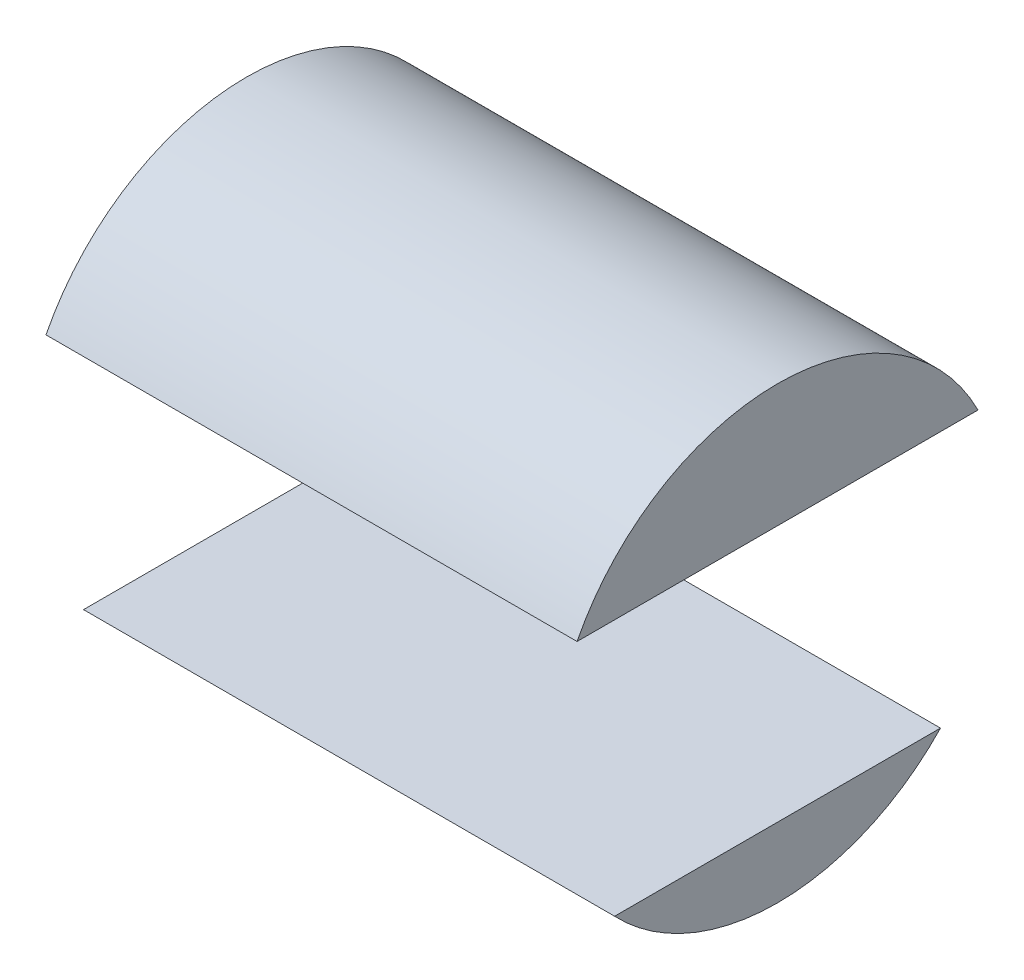
ISO-10303-21;
HEADER;
FILE_DESCRIPTION(('STEP AP214'),'2;1');
FILE_NAME('part.step','',(''),(''),'','','');
FILE_SCHEMA(('AUTOMOTIVE_DESIGN { 1 0 10303 214 1 1 1 1 }'));
ENDSEC;
DATA;
#1=APPLICATION_CONTEXT('core data for automotive mechanical design processes');
#2=APPLICATION_PROTOCOL_DEFINITION('international standard','automotive_design',2000,#1);
#3=PRODUCT_CONTEXT('',#1,'mechanical');
#4=PRODUCT('Part','Part','',(#3));
#5=PRODUCT_RELATED_PRODUCT_CATEGORY('part','',(#4));
#6=PRODUCT_DEFINITION_FORMATION('','',#4);
#7=PRODUCT_DEFINITION_CONTEXT('part definition',#1,'design');
#8=PRODUCT_DEFINITION('design','',#6,#7);
#9=PRODUCT_DEFINITION_SHAPE('','',#8);
#10=(LENGTH_UNIT() NAMED_UNIT(*) SI_UNIT(.MILLI.,.METRE.));
#11=(NAMED_UNIT(*) PLANE_ANGLE_UNIT() SI_UNIT($,.RADIAN.));
#12=(NAMED_UNIT(*) SI_UNIT($,.STERADIAN.) SOLID_ANGLE_UNIT());
#13=UNCERTAINTY_MEASURE_WITH_UNIT(LENGTH_MEASURE(1.E-05),#10,'distance_accuracy_value','');
#14=(GEOMETRIC_REPRESENTATION_CONTEXT(3) GLOBAL_UNCERTAINTY_ASSIGNED_CONTEXT((#13)) GLOBAL_UNIT_ASSIGNED_CONTEXT((#10,
#11,#12)) REPRESENTATION_CONTEXT('',''));
#15=CARTESIAN_POINT('',(0.,0.,0.));
#16=DIRECTION('',(0.,0.,1.));
#17=DIRECTION('',(1.,0.,0.));
#18=AXIS2_PLACEMENT_3D('',#15,#16,#17);
#19=CARTESIAN_POINT('',(120.,0.,0.));
#20=DIRECTION('',(1.,0.,0.));
#21=DIRECTION('',(0.,0.,-1.));
#22=AXIS2_PLACEMENT_3D('',#19,#20,#21);
#23=PLANE('',#22);
#24=DIRECTION('',(0.,0.,1.));
#25=VECTOR('',#24,1.);
#26=CARTESIAN_POINT('',(120.,23.,-30.));
#27=LINE('',#26,#25);
#28=CARTESIAN_POINT('',(120.,23.,-45.2950328402574));
#29=VERTEX_POINT('',#28);
#30=CARTESIAN_POINT('',(120.,23.,45.2950328402574));
#31=VERTEX_POINT('',#30);
#32=EDGE_CURVE('E52',#29,#31,#27,.T.);
#33=ORIENTED_EDGE('',*,*,#32,.F.);
#34=CARTESIAN_POINT('',(120.,0.,0.));
#35=DIRECTION('',(1.,0.,0.));
#36=DIRECTION('',(0.,0.,-1.));
#37=AXIS2_PLACEMENT_3D('',#34,#35,#36);
#38=CIRCLE('',#37,50.8);
#39=EDGE_CURVE('E78',#29,#31,#38,.T.);
#40=ORIENTED_EDGE('',*,*,#39,.T.);
#41=EDGE_LOOP('',(#33,#40));
#42=FACE_BOUND('',#41,.T.);
#43=ADVANCED_FACE('F43',(#42),#23,.T.);
#44=CARTESIAN_POINT('',(0.,0.,0.));
#45=DIRECTION('',(1.,0.,0.));
#46=DIRECTION('',(0.,0.,-1.));
#47=AXIS2_PLACEMENT_3D('',#44,#45,#46);
#48=PLANE('',#47);
#49=CARTESIAN_POINT('',(0.,0.,0.));
#50=DIRECTION('',(1.,0.,0.));
#51=DIRECTION('',(0.,0.,-1.));
#52=AXIS2_PLACEMENT_3D('',#49,#50,#51);
#53=CIRCLE('',#52,50.8);
#54=CARTESIAN_POINT('',(0.,23.,-45.2950328402574));
#55=VERTEX_POINT('',#54);
#56=CARTESIAN_POINT('',(0.,23.,45.2950328402574));
#57=VERTEX_POINT('',#56);
#58=EDGE_CURVE('E46',#55,#57,#53,.T.);
#59=ORIENTED_EDGE('',*,*,#58,.F.);
#60=DIRECTION('',(0.,0.,1.));
#61=VECTOR('',#60,1.);
#62=CARTESIAN_POINT('',(0.,23.,-45.2950328402574));
#63=LINE('',#62,#61);
#64=EDGE_CURVE('E66',#55,#57,#63,.T.);
#65=ORIENTED_EDGE('',*,*,#64,.T.);
#66=EDGE_LOOP('',(#59,#65));
#67=FACE_BOUND('',#66,.T.);
#68=ADVANCED_FACE('F82',(#67),#48,.F.);
#69=CARTESIAN_POINT('',(120.,0.,0.));
#70=DIRECTION('',(-1.,0.,0.));
#71=DIRECTION('',(0.,0.,1.));
#72=AXIS2_PLACEMENT_3D('',#69,#70,#71);
#73=CYLINDRICAL_SURFACE('',#72,50.8);
#74=ORIENTED_EDGE('',*,*,#39,.F.);
#75=DIRECTION('',(1.,0.,0.));
#76=VECTOR('',#75,1.);
#77=CARTESIAN_POINT('',(0.,23.,-45.2950328402574));
#78=LINE('',#77,#76);
#79=EDGE_CURVE('E12',#55,#29,#78,.T.);
#80=ORIENTED_EDGE('',*,*,#79,.F.);
#81=ORIENTED_EDGE('',*,*,#58,.T.);
#82=DIRECTION('',(1.,0.,0.));
#83=VECTOR('',#82,1.);
#84=CARTESIAN_POINT('',(0.,23.,45.2950328402574));
#85=LINE('',#84,#83);
#86=EDGE_CURVE('E71',#57,#31,#85,.T.);
#87=ORIENTED_EDGE('',*,*,#86,.T.);
#88=EDGE_LOOP('',(#74,#80,#81,#87));
#89=FACE_BOUND('',#88,.T.);
#90=ADVANCED_FACE('F77',(#89),#73,.T.);
#91=CARTESIAN_POINT('',(120.,23.,-30.));
#92=DIRECTION('',(0.,-1.,0.));
#93=DIRECTION('',(0.,0.,-1.));
#94=AXIS2_PLACEMENT_3D('',#91,#92,#93);
#95=PLANE('',#94);
#96=ORIENTED_EDGE('',*,*,#86,.F.);
#97=ORIENTED_EDGE('',*,*,#64,.F.);
#98=ORIENTED_EDGE('',*,*,#79,.T.);
#99=ORIENTED_EDGE('',*,*,#32,.T.);
#100=EDGE_LOOP('',(#96,#97,#98,#99));
#101=FACE_BOUND('',#100,.T.);
#102=ADVANCED_FACE('F70',(#101),#95,.T.);
#103=CLOSED_SHELL('',(#43,#68,#90,#102));
#104=MANIFOLD_SOLID_BREP('B2',#103);
#105=CARTESIAN_POINT('',(120.,-35.,30.));
#106=DIRECTION('',(0.,1.,0.));
#107=DIRECTION('',(0.,0.,1.));
#108=AXIS2_PLACEMENT_3D('',#105,#106,#107);
#109=PLANE('',#108);
#110=DIRECTION('',(0.,0.,-1.));
#111=VECTOR('',#110,1.);
#112=CARTESIAN_POINT('',(0.,-35.,30.));
#113=LINE('',#112,#111);
#114=CARTESIAN_POINT('',(0.,-35.,36.8190168255482));
#115=VERTEX_POINT('',#114);
#116=CARTESIAN_POINT('',(0.,-35.,-36.8190168255482));
#117=VERTEX_POINT('',#116);
#118=EDGE_CURVE('E134',#115,#117,#113,.T.);
#119=ORIENTED_EDGE('',*,*,#118,.F.);
#120=DIRECTION('',(1.,0.,0.));
#121=VECTOR('',#120,1.);
#122=CARTESIAN_POINT('',(0.,-35.,36.8190168255482));
#123=LINE('',#122,#121);
#124=CARTESIAN_POINT('',(120.,-35.,36.8190168255482));
#125=VERTEX_POINT('',#124);
#126=EDGE_CURVE('E148',#115,#125,#123,.T.);
#127=ORIENTED_EDGE('',*,*,#126,.T.);
#128=DIRECTION('',(0.,0.,-1.));
#129=VECTOR('',#128,1.);
#130=CARTESIAN_POINT('',(120.,-35.,30.));
#131=LINE('',#130,#129);
#132=CARTESIAN_POINT('',(120.,-35.,-36.8190168255482));
#133=VERTEX_POINT('',#132);
#134=EDGE_CURVE('E141',#125,#133,#131,.T.);
#135=ORIENTED_EDGE('',*,*,#134,.T.);
#136=DIRECTION('',(1.,0.,0.));
#137=VECTOR('',#136,1.);
#138=CARTESIAN_POINT('',(0.,-35.,-36.8190168255482));
#139=LINE('',#138,#137);
#140=EDGE_CURVE('E145',#117,#133,#139,.T.);
#141=ORIENTED_EDGE('',*,*,#140,.F.);
#142=EDGE_LOOP('',(#119,#127,#135,#141));
#143=FACE_BOUND('',#142,.T.);
#144=ADVANCED_FACE('F118',(#143),#109,.T.);
#145=CARTESIAN_POINT('',(120.,0.,0.));
#146=DIRECTION('',(-1.,0.,0.));
#147=DIRECTION('',(0.,0.,1.));
#148=AXIS2_PLACEMENT_3D('',#145,#146,#147);
#149=CYLINDRICAL_SURFACE('',#148,50.8);
#150=CARTESIAN_POINT('',(120.,0.,0.));
#151=DIRECTION('',(1.,0.,0.));
#152=DIRECTION('',(0.,0.,-1.));
#153=AXIS2_PLACEMENT_3D('',#150,#151,#152);
#154=CIRCLE('',#153,50.8);
#155=EDGE_CURVE('E41',#125,#133,#154,.T.);
#156=ORIENTED_EDGE('',*,*,#155,.F.);
#157=ORIENTED_EDGE('',*,*,#126,.F.);
#158=CARTESIAN_POINT('',(0.,0.,0.));
#159=DIRECTION('',(1.,0.,0.));
#160=DIRECTION('',(0.,0.,-1.));
#161=AXIS2_PLACEMENT_3D('',#158,#159,#160);
#162=CIRCLE('',#161,50.8);
#163=EDGE_CURVE('E122',#115,#117,#162,.T.);
#164=ORIENTED_EDGE('',*,*,#163,.T.);
#165=ORIENTED_EDGE('',*,*,#140,.T.);
#166=EDGE_LOOP('',(#156,#157,#164,#165));
#167=FACE_BOUND('',#166,.T.);
#168=ADVANCED_FACE('F120',(#167),#149,.T.);
#169=CARTESIAN_POINT('',(0.,0.,0.));
#170=DIRECTION('',(1.,0.,0.));
#171=DIRECTION('',(0.,0.,-1.));
#172=AXIS2_PLACEMENT_3D('',#169,#170,#171);
#173=PLANE('',#172);
#174=ORIENTED_EDGE('',*,*,#163,.F.);
#175=ORIENTED_EDGE('',*,*,#118,.T.);
#176=EDGE_LOOP('',(#174,#175));
#177=FACE_BOUND('',#176,.T.);
#178=ADVANCED_FACE('F155',(#177),#173,.F.);
#179=CARTESIAN_POINT('',(120.,0.,0.));
#180=DIRECTION('',(1.,0.,0.));
#181=DIRECTION('',(0.,0.,-1.));
#182=AXIS2_PLACEMENT_3D('',#179,#180,#181);
#183=PLANE('',#182);
#184=ORIENTED_EDGE('',*,*,#134,.F.);
#185=ORIENTED_EDGE('',*,*,#155,.T.);
#186=EDGE_LOOP('',(#184,#185));
#187=FACE_BOUND('',#186,.T.);
#188=ADVANCED_FACE('F153',(#187),#183,.T.);
#189=CLOSED_SHELL('',(#144,#168,#178,#188));
#190=MANIFOLD_SOLID_BREP('B6',#189);
#191=ADVANCED_BREP_SHAPE_REPRESENTATION('',(#18,#104,#190),#14);
#192=SHAPE_DEFINITION_REPRESENTATION(#9,#191);
ENDSEC;
END-ISO-10303-21;
